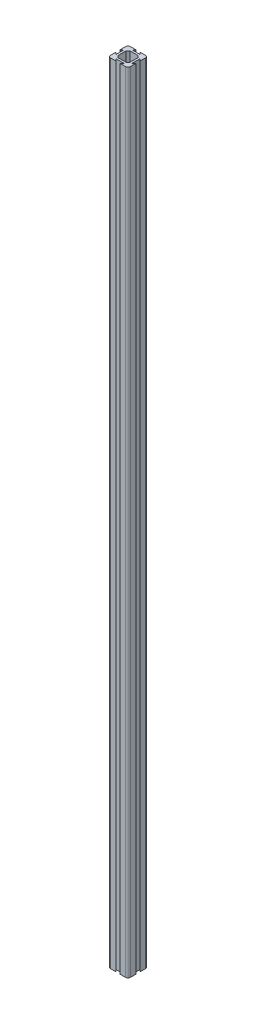
ISO-10303-21;
HEADER;
FILE_DESCRIPTION(('STEP AP214'),'2;1');
FILE_NAME('part.step','',(''),(''),'','','');
FILE_SCHEMA(('AUTOMOTIVE_DESIGN { 1 0 10303 214 1 1 1 1 }'));
ENDSEC;
DATA;
#1=APPLICATION_CONTEXT('core data for automotive mechanical design processes');
#2=APPLICATION_PROTOCOL_DEFINITION('international standard','automotive_design',2000,#1);
#3=PRODUCT_CONTEXT('',#1,'mechanical');
#4=PRODUCT('Part','Part','',(#3));
#5=PRODUCT_RELATED_PRODUCT_CATEGORY('part','',(#4));
#6=PRODUCT_DEFINITION_FORMATION('','',#4);
#7=PRODUCT_DEFINITION_CONTEXT('part definition',#1,'design');
#8=PRODUCT_DEFINITION('design','',#6,#7);
#9=PRODUCT_DEFINITION_SHAPE('','',#8);
#10=(LENGTH_UNIT() NAMED_UNIT(*) SI_UNIT(.MILLI.,.METRE.));
#11=(NAMED_UNIT(*) PLANE_ANGLE_UNIT() SI_UNIT($,.RADIAN.));
#12=(NAMED_UNIT(*) SI_UNIT($,.STERADIAN.) SOLID_ANGLE_UNIT());
#13=UNCERTAINTY_MEASURE_WITH_UNIT(LENGTH_MEASURE(1.E-05),#10,'distance_accuracy_value','');
#14=(GEOMETRIC_REPRESENTATION_CONTEXT(3) GLOBAL_UNCERTAINTY_ASSIGNED_CONTEXT((#13)) GLOBAL_UNIT_ASSIGNED_CONTEXT((#10,
#11,#12)) REPRESENTATION_CONTEXT('',''));
#15=CARTESIAN_POINT('',(0.,0.,0.));
#16=DIRECTION('',(0.,0.,1.));
#17=DIRECTION('',(1.,0.,0.));
#18=AXIS2_PLACEMENT_3D('',#15,#16,#17);
#19=CARTESIAN_POINT('',(9.5,1000.,-9.5));
#20=DIRECTION('',(0.,-1.,0.));
#21=DIRECTION('',(0.,0.,-1.));
#22=AXIS2_PLACEMENT_3D('',#19,#20,#21);
#23=PLANE('',#22);
#24=DIRECTION('',(0.707106781186551,0.,-0.707106781186544));
#25=VECTOR('',#24,1.);
#26=CARTESIAN_POINT('',(-2.5,1000.,-12.5));
#27=LINE('',#26,#25);
#28=CARTESIAN_POINT('',(-5.00000000000002,1000.,-10.));
#29=VERTEX_POINT('',#28);
#30=CARTESIAN_POINT('',(-2.5,1000.,-12.5));
#31=VERTEX_POINT('',#30);
#32=EDGE_CURVE('E308',#29,#31,#27,.T.);
#33=ORIENTED_EDGE('',*,*,#32,.T.);
#34=DIRECTION('',(-1.,0.,0.));
#35=VECTOR('',#34,1.);
#36=CARTESIAN_POINT('',(-9.49999999999998,1000.,-12.5));
#37=LINE('',#36,#35);
#38=CARTESIAN_POINT('',(-9.49999999999998,1000.,-12.5));
#39=VERTEX_POINT('',#38);
#40=EDGE_CURVE('E311',#31,#39,#37,.T.);
#41=ORIENTED_EDGE('',*,*,#40,.T.);
#42=CARTESIAN_POINT('',(-9.5,1000.,-9.5));
#43=DIRECTION('',(0.,1.,0.));
#44=DIRECTION('',(0.,0.,1.));
#45=AXIS2_PLACEMENT_3D('',#42,#43,#44);
#46=CIRCLE('',#45,3.);
#47=CARTESIAN_POINT('',(-12.5,1000.,-9.49999999999998));
#48=VERTEX_POINT('',#47);
#49=EDGE_CURVE('E314',#39,#48,#46,.T.);
#50=ORIENTED_EDGE('',*,*,#49,.T.);
#51=DIRECTION('',(0.,0.,1.));
#52=VECTOR('',#51,1.);
#53=CARTESIAN_POINT('',(-12.5,1000.,-2.5));
#54=LINE('',#53,#52);
#55=CARTESIAN_POINT('',(-12.5,1000.,-2.5));
#56=VERTEX_POINT('',#55);
#57=EDGE_CURVE('E316',#48,#56,#54,.T.);
#58=ORIENTED_EDGE('',*,*,#57,.T.);
#59=DIRECTION('',(0.707106781186552,0.,-0.707106781186543));
#60=VECTOR('',#59,1.);
#61=CARTESIAN_POINT('',(-10.,1000.,-4.99999999999997));
#62=LINE('',#61,#60);
#63=CARTESIAN_POINT('',(-10.,1000.,-4.99999999999997));
#64=VERTEX_POINT('',#63);
#65=EDGE_CURVE('E318',#56,#64,#62,.T.);
#66=ORIENTED_EDGE('',*,*,#65,.T.);
#67=DIRECTION('',(0.,0.,1.));
#68=VECTOR('',#67,1.);
#69=CARTESIAN_POINT('',(-10.,1000.,5.00000000000003));
#70=LINE('',#69,#68);
#71=CARTESIAN_POINT('',(-10.,1000.,5.00000000000003));
#72=VERTEX_POINT('',#71);
#73=EDGE_CURVE('E320',#64,#72,#70,.T.);
#74=ORIENTED_EDGE('',*,*,#73,.T.);
#75=DIRECTION('',(-0.707106781186544,0.,-0.707106781186551));
#76=VECTOR('',#75,1.);
#77=CARTESIAN_POINT('',(-12.5,1000.,2.5));
#78=LINE('',#77,#76);
#79=CARTESIAN_POINT('',(-12.5,1000.,2.5));
#80=VERTEX_POINT('',#79);
#81=EDGE_CURVE('E322',#72,#80,#78,.T.);
#82=ORIENTED_EDGE('',*,*,#81,.T.);
#83=DIRECTION('',(0.,0.,1.));
#84=VECTOR('',#83,1.);
#85=CARTESIAN_POINT('',(-12.5,1000.,9.49999999999998));
#86=LINE('',#85,#84);
#87=CARTESIAN_POINT('',(-12.5,1000.,9.49999999999998));
#88=VERTEX_POINT('',#87);
#89=EDGE_CURVE('E324',#80,#88,#86,.T.);
#90=ORIENTED_EDGE('',*,*,#89,.T.);
#91=CARTESIAN_POINT('',(-9.5,1000.,9.5));
#92=DIRECTION('',(0.,1.,0.));
#93=DIRECTION('',(0.,0.,-1.));
#94=AXIS2_PLACEMENT_3D('',#91,#92,#93);
#95=CIRCLE('',#94,3.);
#96=CARTESIAN_POINT('',(-9.49999999999998,1000.,12.5));
#97=VERTEX_POINT('',#96);
#98=EDGE_CURVE('E326',#88,#97,#95,.T.);
#99=ORIENTED_EDGE('',*,*,#98,.T.);
#100=DIRECTION('',(1.,0.,0.));
#101=VECTOR('',#100,1.);
#102=CARTESIAN_POINT('',(-2.5,1000.,12.5));
#103=LINE('',#102,#101);
#104=CARTESIAN_POINT('',(-2.5,1000.,12.5));
#105=VERTEX_POINT('',#104);
#106=EDGE_CURVE('E328',#97,#105,#103,.T.);
#107=ORIENTED_EDGE('',*,*,#106,.T.);
#108=DIRECTION('',(-0.707106781186544,0.,-0.707106781186551));
#109=VECTOR('',#108,1.);
#110=CARTESIAN_POINT('',(-2.5,1000.,12.5));
#111=LINE('',#110,#109);
#112=CARTESIAN_POINT('',(-4.99999999999998,1000.,10.));
#113=VERTEX_POINT('',#112);
#114=EDGE_CURVE('E330',#105,#113,#111,.T.);
#115=ORIENTED_EDGE('',*,*,#114,.T.);
#116=DIRECTION('',(1.,0.,0.));
#117=VECTOR('',#116,1.);
#118=CARTESIAN_POINT('',(-4.99999999999998,1000.,10.));
#119=LINE('',#118,#117);
#120=CARTESIAN_POINT('',(5.00000000000002,1000.,10.));
#121=VERTEX_POINT('',#120);
#122=EDGE_CURVE('E332',#113,#121,#119,.T.);
#123=ORIENTED_EDGE('',*,*,#122,.T.);
#124=DIRECTION('',(-0.707106781186551,0.,0.707106781186544));
#125=VECTOR('',#124,1.);
#126=CARTESIAN_POINT('',(5.00000000000002,1000.,10.));
#127=LINE('',#126,#125);
#128=CARTESIAN_POINT('',(2.5,1000.,12.5));
#129=VERTEX_POINT('',#128);
#130=EDGE_CURVE('E334',#121,#129,#127,.T.);
#131=ORIENTED_EDGE('',*,*,#130,.T.);
#132=DIRECTION('',(1.,0.,0.));
#133=VECTOR('',#132,1.);
#134=CARTESIAN_POINT('',(9.49999999999998,1000.,12.5));
#135=LINE('',#134,#133);
#136=CARTESIAN_POINT('',(9.49999999999998,1000.,12.5));
#137=VERTEX_POINT('',#136);
#138=EDGE_CURVE('E336',#129,#137,#135,.T.);
#139=ORIENTED_EDGE('',*,*,#138,.T.);
#140=CARTESIAN_POINT('',(9.5,1000.,9.5));
#141=DIRECTION('',(0.,1.,0.));
#142=DIRECTION('',(0.,0.,-1.));
#143=AXIS2_PLACEMENT_3D('',#140,#141,#142);
#144=CIRCLE('',#143,3.);
#145=CARTESIAN_POINT('',(12.5,1000.,9.49999999999998));
#146=VERTEX_POINT('',#145);
#147=EDGE_CURVE('E338',#137,#146,#144,.T.);
#148=ORIENTED_EDGE('',*,*,#147,.T.);
#149=DIRECTION('',(0.,0.,-1.));
#150=VECTOR('',#149,1.);
#151=CARTESIAN_POINT('',(12.5,1000.,2.5));
#152=LINE('',#151,#150);
#153=CARTESIAN_POINT('',(12.5,1000.,2.5));
#154=VERTEX_POINT('',#153);
#155=EDGE_CURVE('E340',#146,#154,#152,.T.);
#156=ORIENTED_EDGE('',*,*,#155,.T.);
#157=DIRECTION('',(-0.707106781186551,0.,0.707106781186544));
#158=VECTOR('',#157,1.);
#159=CARTESIAN_POINT('',(9.99999999999999,1000.,4.99999999999998));
#160=LINE('',#159,#158);
#161=CARTESIAN_POINT('',(9.99999999999999,1000.,4.99999999999998));
#162=VERTEX_POINT('',#161);
#163=EDGE_CURVE('E342',#154,#162,#160,.T.);
#164=ORIENTED_EDGE('',*,*,#163,.T.);
#165=DIRECTION('',(0.,0.,-1.));
#166=VECTOR('',#165,1.);
#167=CARTESIAN_POINT('',(10.,1000.,-5.00000000000002));
#168=LINE('',#167,#166);
#169=CARTESIAN_POINT('',(10.,1000.,-5.00000000000002));
#170=VERTEX_POINT('',#169);
#171=EDGE_CURVE('E344',#162,#170,#168,.T.);
#172=ORIENTED_EDGE('',*,*,#171,.T.);
#173=DIRECTION('',(0.707106781186545,0.,0.70710678118655));
#174=VECTOR('',#173,1.);
#175=CARTESIAN_POINT('',(12.5,1000.,-2.5));
#176=LINE('',#175,#174);
#177=CARTESIAN_POINT('',(12.5,1000.,-2.5));
#178=VERTEX_POINT('',#177);
#179=EDGE_CURVE('E346',#170,#178,#176,.T.);
#180=ORIENTED_EDGE('',*,*,#179,.T.);
#181=DIRECTION('',(0.,0.,-1.));
#182=VECTOR('',#181,1.);
#183=CARTESIAN_POINT('',(12.5,1000.,-9.49999999999998));
#184=LINE('',#183,#182);
#185=CARTESIAN_POINT('',(12.5,1000.,-9.49999999999998));
#186=VERTEX_POINT('',#185);
#187=EDGE_CURVE('E348',#178,#186,#184,.T.);
#188=ORIENTED_EDGE('',*,*,#187,.T.);
#189=CARTESIAN_POINT('',(9.5,1000.,-9.5));
#190=DIRECTION('',(0.,1.,0.));
#191=DIRECTION('',(0.,0.,-1.));
#192=AXIS2_PLACEMENT_3D('',#189,#190,#191);
#193=CIRCLE('',#192,3.);
#194=CARTESIAN_POINT('',(9.49999999999998,1000.,-12.5));
#195=VERTEX_POINT('',#194);
#196=EDGE_CURVE('E350',#186,#195,#193,.T.);
#197=ORIENTED_EDGE('',*,*,#196,.T.);
#198=DIRECTION('',(-1.,0.,0.));
#199=VECTOR('',#198,1.);
#200=CARTESIAN_POINT('',(2.5,1000.,-12.5));
#201=LINE('',#200,#199);
#202=CARTESIAN_POINT('',(2.5,1000.,-12.5));
#203=VERTEX_POINT('',#202);
#204=EDGE_CURVE('E352',#195,#203,#201,.T.);
#205=ORIENTED_EDGE('',*,*,#204,.T.);
#206=DIRECTION('',(0.707106781186544,0.,0.707106781186551));
#207=VECTOR('',#206,1.);
#208=CARTESIAN_POINT('',(4.99999999999998,1000.,-10.));
#209=LINE('',#208,#207);
#210=CARTESIAN_POINT('',(4.99999999999998,1000.,-10.));
#211=VERTEX_POINT('',#210);
#212=EDGE_CURVE('E354',#203,#211,#209,.T.);
#213=ORIENTED_EDGE('',*,*,#212,.T.);
#214=DIRECTION('',(-1.,0.,0.));
#215=VECTOR('',#214,1.);
#216=CARTESIAN_POINT('',(-5.00000000000002,1000.,-10.));
#217=LINE('',#216,#215);
#218=EDGE_CURVE('E356',#211,#29,#217,.T.);
#219=ORIENTED_EDGE('',*,*,#218,.T.);
#220=EDGE_LOOP('',(#33,#41,#50,#58,#66,#74,#82,#90,#99,#107,#115,#123,#131,#139,#148,#156,#164,
#172,#180,#188,#197,#205,#213,#219));
#221=FACE_BOUND('',#220,.T.);
#222=DIRECTION('',(0.,0.,1.));
#223=VECTOR('',#222,1.);
#224=CARTESIAN_POINT('',(-7.5,1000.,5.));
#225=LINE('',#224,#223);
#226=CARTESIAN_POINT('',(-7.5,1000.,-5.));
#227=VERTEX_POINT('',#226);
#228=CARTESIAN_POINT('',(-7.5,1000.,5.));
#229=VERTEX_POINT('',#228);
#230=EDGE_CURVE('E243',#227,#229,#225,.T.);
#231=ORIENTED_EDGE('',*,*,#230,.F.);
#232=DIRECTION('',(-0.707106781186553,0.,0.707106781186543));
#233=VECTOR('',#232,1.);
#234=CARTESIAN_POINT('',(-7.5,1000.,-5.));
#235=LINE('',#234,#233);
#236=CARTESIAN_POINT('',(-4.99999999999996,1000.,-7.5));
#237=VERTEX_POINT('',#236);
#238=EDGE_CURVE('E276',#237,#227,#235,.T.);
#239=ORIENTED_EDGE('',*,*,#238,.F.);
#240=DIRECTION('',(-1.,0.,0.));
#241=VECTOR('',#240,1.);
#242=CARTESIAN_POINT('',(-4.99999999999996,1000.,-7.5));
#243=LINE('',#242,#241);
#244=CARTESIAN_POINT('',(5.00000000000003,1000.,-7.50000000000001));
#245=VERTEX_POINT('',#244);
#246=EDGE_CURVE('E274',#245,#237,#243,.T.);
#247=ORIENTED_EDGE('',*,*,#246,.F.);
#248=DIRECTION('',(-0.707106781186543,0.,-0.707106781186552));
#249=VECTOR('',#248,1.);
#250=CARTESIAN_POINT('',(5.00000000000003,1000.,-7.50000000000001));
#251=LINE('',#250,#249);
#252=CARTESIAN_POINT('',(7.50000000000004,1000.,-4.99999999999997));
#253=VERTEX_POINT('',#252);
#254=EDGE_CURVE('E272',#253,#245,#251,.T.);
#255=ORIENTED_EDGE('',*,*,#254,.F.);
#256=DIRECTION('',(0.,0.,-1.));
#257=VECTOR('',#256,1.);
#258=CARTESIAN_POINT('',(7.50000000000004,1000.,-4.99999999999997));
#259=LINE('',#258,#257);
#260=CARTESIAN_POINT('',(7.50000000000004,1000.,5.00000000000003));
#261=VERTEX_POINT('',#260);
#262=EDGE_CURVE('E270',#261,#253,#259,.T.);
#263=ORIENTED_EDGE('',*,*,#262,.F.);
#264=DIRECTION('',(0.707106781186552,0.,-0.707106781186543));
#265=VECTOR('',#264,1.);
#266=CARTESIAN_POINT('',(7.50000000000004,1000.,5.00000000000003));
#267=LINE('',#266,#265);
#268=CARTESIAN_POINT('',(5.00000000000001,1000.,7.50000000000004));
#269=VERTEX_POINT('',#268);
#270=EDGE_CURVE('E266',#269,#261,#267,.T.);
#271=ORIENTED_EDGE('',*,*,#270,.F.);
#272=DIRECTION('',(1.,0.,0.));
#273=VECTOR('',#272,1.);
#274=CARTESIAN_POINT('',(5.00000000000001,1000.,7.50000000000004));
#275=LINE('',#274,#273);
#276=CARTESIAN_POINT('',(-4.99999999999999,1000.,7.50000000000004));
#277=VERTEX_POINT('',#276);
#278=EDGE_CURVE('E264',#277,#269,#275,.T.);
#279=ORIENTED_EDGE('',*,*,#278,.F.);
#280=DIRECTION('',(0.707106781186543,0.,0.707106781186552));
#281=VECTOR('',#280,1.);
#282=CARTESIAN_POINT('',(-4.99999999999999,1000.,7.50000000000004));
#283=LINE('',#282,#281);
#284=EDGE_CURVE('E251',#229,#277,#283,.T.);
#285=ORIENTED_EDGE('',*,*,#284,.F.);
#286=EDGE_LOOP('',(#231,#239,#247,#255,#263,#271,#279,#285));
#287=FACE_BOUND('',#286,.T.);
#288=ADVANCED_FACE('F34',(#221,#287),#23,.F.);
#289=CARTESIAN_POINT('',(9.5,0.,-9.5));
#290=DIRECTION('',(0.,-1.,0.));
#291=DIRECTION('',(0.,0.,-1.));
#292=AXIS2_PLACEMENT_3D('',#289,#290,#291);
#293=PLANE('',#292);
#294=DIRECTION('',(0.707106781186551,0.,-0.707106781186544));
#295=VECTOR('',#294,1.);
#296=CARTESIAN_POINT('',(-2.5,0.,-12.5));
#297=LINE('',#296,#295);
#298=CARTESIAN_POINT('',(-5.00000000000002,0.,-10.));
#299=VERTEX_POINT('',#298);
#300=CARTESIAN_POINT('',(-2.5,0.,-12.5));
#301=VERTEX_POINT('',#300);
#302=EDGE_CURVE('E259',#299,#301,#297,.T.);
#303=ORIENTED_EDGE('',*,*,#302,.F.);
#304=DIRECTION('',(-1.,0.,0.));
#305=VECTOR('',#304,1.);
#306=CARTESIAN_POINT('',(-5.00000000000002,0.,-10.));
#307=LINE('',#306,#305);
#308=CARTESIAN_POINT('',(4.99999999999998,0.,-10.));
#309=VERTEX_POINT('',#308);
#310=EDGE_CURVE('E312',#309,#299,#307,.T.);
#311=ORIENTED_EDGE('',*,*,#310,.F.);
#312=DIRECTION('',(0.707106781186544,0.,0.707106781186551));
#313=VECTOR('',#312,1.);
#314=CARTESIAN_POINT('',(4.99999999999998,0.,-10.));
#315=LINE('',#314,#313);
#316=CARTESIAN_POINT('',(2.5,0.,-12.5));
#317=VERTEX_POINT('',#316);
#318=EDGE_CURVE('E403',#317,#309,#315,.T.);
#319=ORIENTED_EDGE('',*,*,#318,.F.);
#320=DIRECTION('',(-1.,0.,0.));
#321=VECTOR('',#320,1.);
#322=CARTESIAN_POINT('',(2.5,0.,-12.5));
#323=LINE('',#322,#321);
#324=CARTESIAN_POINT('',(9.49999999999998,0.,-12.5));
#325=VERTEX_POINT('',#324);
#326=EDGE_CURVE('E401',#325,#317,#323,.T.);
#327=ORIENTED_EDGE('',*,*,#326,.F.);
#328=CARTESIAN_POINT('',(9.5,0.,-9.5));
#329=DIRECTION('',(0.,1.,0.));
#330=DIRECTION('',(0.,0.,-1.));
#331=AXIS2_PLACEMENT_3D('',#328,#329,#330);
#332=CIRCLE('',#331,3.);
#333=CARTESIAN_POINT('',(12.5,0.,-9.49999999999998));
#334=VERTEX_POINT('',#333);
#335=EDGE_CURVE('E399',#334,#325,#332,.T.);
#336=ORIENTED_EDGE('',*,*,#335,.F.);
#337=DIRECTION('',(0.,0.,-1.));
#338=VECTOR('',#337,1.);
#339=CARTESIAN_POINT('',(12.5,0.,-9.49999999999998));
#340=LINE('',#339,#338);
#341=CARTESIAN_POINT('',(12.5,0.,-2.5));
#342=VERTEX_POINT('',#341);
#343=EDGE_CURVE('E397',#342,#334,#340,.T.);
#344=ORIENTED_EDGE('',*,*,#343,.F.);
#345=DIRECTION('',(0.707106781186545,0.,0.70710678118655));
#346=VECTOR('',#345,1.);
#347=CARTESIAN_POINT('',(12.5,0.,-2.5));
#348=LINE('',#347,#346);
#349=CARTESIAN_POINT('',(10.,0.,-5.00000000000002));
#350=VERTEX_POINT('',#349);
#351=EDGE_CURVE('E395',#350,#342,#348,.T.);
#352=ORIENTED_EDGE('',*,*,#351,.F.);
#353=DIRECTION('',(0.,0.,-1.));
#354=VECTOR('',#353,1.);
#355=CARTESIAN_POINT('',(10.,0.,-5.00000000000002));
#356=LINE('',#355,#354);
#357=CARTESIAN_POINT('',(9.99999999999999,0.,4.99999999999998));
#358=VERTEX_POINT('',#357);
#359=EDGE_CURVE('E393',#358,#350,#356,.T.);
#360=ORIENTED_EDGE('',*,*,#359,.F.);
#361=DIRECTION('',(-0.707106781186551,0.,0.707106781186544));
#362=VECTOR('',#361,1.);
#363=CARTESIAN_POINT('',(9.99999999999999,0.,4.99999999999998));
#364=LINE('',#363,#362);
#365=CARTESIAN_POINT('',(12.5,0.,2.5));
#366=VERTEX_POINT('',#365);
#367=EDGE_CURVE('E391',#366,#358,#364,.T.);
#368=ORIENTED_EDGE('',*,*,#367,.F.);
#369=DIRECTION('',(0.,0.,-1.));
#370=VECTOR('',#369,1.);
#371=CARTESIAN_POINT('',(12.5,0.,2.5));
#372=LINE('',#371,#370);
#373=CARTESIAN_POINT('',(12.5,0.,9.49999999999998));
#374=VERTEX_POINT('',#373);
#375=EDGE_CURVE('E389',#374,#366,#372,.T.);
#376=ORIENTED_EDGE('',*,*,#375,.F.);
#377=CARTESIAN_POINT('',(9.5,0.,9.5));
#378=DIRECTION('',(0.,1.,0.));
#379=DIRECTION('',(0.,0.,-1.));
#380=AXIS2_PLACEMENT_3D('',#377,#378,#379);
#381=CIRCLE('',#380,3.);
#382=CARTESIAN_POINT('',(9.49999999999998,0.,12.5));
#383=VERTEX_POINT('',#382);
#384=EDGE_CURVE('E387',#383,#374,#381,.T.);
#385=ORIENTED_EDGE('',*,*,#384,.F.);
#386=DIRECTION('',(1.,0.,0.));
#387=VECTOR('',#386,1.);
#388=CARTESIAN_POINT('',(9.49999999999998,0.,12.5));
#389=LINE('',#388,#387);
#390=CARTESIAN_POINT('',(2.5,0.,12.5));
#391=VERTEX_POINT('',#390);
#392=EDGE_CURVE('E385',#391,#383,#389,.T.);
#393=ORIENTED_EDGE('',*,*,#392,.F.);
#394=DIRECTION('',(-0.707106781186551,0.,0.707106781186544));
#395=VECTOR('',#394,1.);
#396=CARTESIAN_POINT('',(5.00000000000002,0.,10.));
#397=LINE('',#396,#395);
#398=CARTESIAN_POINT('',(5.00000000000002,0.,10.));
#399=VERTEX_POINT('',#398);
#400=EDGE_CURVE('E383',#399,#391,#397,.T.);
#401=ORIENTED_EDGE('',*,*,#400,.F.);
#402=DIRECTION('',(1.,0.,0.));
#403=VECTOR('',#402,1.);
#404=CARTESIAN_POINT('',(-4.99999999999998,0.,10.));
#405=LINE('',#404,#403);
#406=CARTESIAN_POINT('',(-4.99999999999998,0.,10.));
#407=VERTEX_POINT('',#406);
#408=EDGE_CURVE('E381',#407,#399,#405,.T.);
#409=ORIENTED_EDGE('',*,*,#408,.F.);
#410=DIRECTION('',(-0.707106781186544,0.,-0.707106781186551));
#411=VECTOR('',#410,1.);
#412=CARTESIAN_POINT('',(-2.5,0.,12.5));
#413=LINE('',#412,#411);
#414=CARTESIAN_POINT('',(-2.5,0.,12.5));
#415=VERTEX_POINT('',#414);
#416=EDGE_CURVE('E379',#415,#407,#413,.T.);
#417=ORIENTED_EDGE('',*,*,#416,.F.);
#418=DIRECTION('',(1.,0.,0.));
#419=VECTOR('',#418,1.);
#420=CARTESIAN_POINT('',(-2.5,0.,12.5));
#421=LINE('',#420,#419);
#422=CARTESIAN_POINT('',(-9.49999999999998,0.,12.5));
#423=VERTEX_POINT('',#422);
#424=EDGE_CURVE('E377',#423,#415,#421,.T.);
#425=ORIENTED_EDGE('',*,*,#424,.F.);
#426=CARTESIAN_POINT('',(-9.5,0.,9.5));
#427=DIRECTION('',(0.,1.,0.));
#428=DIRECTION('',(0.,0.,-1.));
#429=AXIS2_PLACEMENT_3D('',#426,#427,#428);
#430=CIRCLE('',#429,3.);
#431=CARTESIAN_POINT('',(-12.5,0.,9.49999999999998));
#432=VERTEX_POINT('',#431);
#433=EDGE_CURVE('E375',#432,#423,#430,.T.);
#434=ORIENTED_EDGE('',*,*,#433,.F.);
#435=DIRECTION('',(0.,0.,1.));
#436=VECTOR('',#435,1.);
#437=CARTESIAN_POINT('',(-12.5,0.,9.49999999999998));
#438=LINE('',#437,#436);
#439=CARTESIAN_POINT('',(-12.5,0.,2.5));
#440=VERTEX_POINT('',#439);
#441=EDGE_CURVE('E373',#440,#432,#438,.T.);
#442=ORIENTED_EDGE('',*,*,#441,.F.);
#443=DIRECTION('',(-0.707106781186544,0.,-0.707106781186551));
#444=VECTOR('',#443,1.);
#445=CARTESIAN_POINT('',(-12.5,0.,2.5));
#446=LINE('',#445,#444);
#447=CARTESIAN_POINT('',(-10.,0.,5.00000000000003));
#448=VERTEX_POINT('',#447);
#449=EDGE_CURVE('E371',#448,#440,#446,.T.);
#450=ORIENTED_EDGE('',*,*,#449,.F.);
#451=DIRECTION('',(0.,0.,1.));
#452=VECTOR('',#451,1.);
#453=CARTESIAN_POINT('',(-10.,0.,5.00000000000003));
#454=LINE('',#453,#452);
#455=CARTESIAN_POINT('',(-10.,0.,-4.99999999999997));
#456=VERTEX_POINT('',#455);
#457=EDGE_CURVE('E369',#456,#448,#454,.T.);
#458=ORIENTED_EDGE('',*,*,#457,.F.);
#459=DIRECTION('',(0.707106781186552,0.,-0.707106781186543));
#460=VECTOR('',#459,1.);
#461=CARTESIAN_POINT('',(-10.,0.,-4.99999999999997));
#462=LINE('',#461,#460);
#463=CARTESIAN_POINT('',(-12.5,0.,-2.5));
#464=VERTEX_POINT('',#463);
#465=EDGE_CURVE('E367',#464,#456,#462,.T.);
#466=ORIENTED_EDGE('',*,*,#465,.F.);
#467=DIRECTION('',(0.,0.,1.));
#468=VECTOR('',#467,1.);
#469=CARTESIAN_POINT('',(-12.5,0.,-2.5));
#470=LINE('',#469,#468);
#471=CARTESIAN_POINT('',(-12.5,0.,-9.49999999999998));
#472=VERTEX_POINT('',#471);
#473=EDGE_CURVE('E365',#472,#464,#470,.T.);
#474=ORIENTED_EDGE('',*,*,#473,.F.);
#475=CARTESIAN_POINT('',(-9.5,0.,-9.5));
#476=DIRECTION('',(0.,1.,0.));
#477=DIRECTION('',(0.,0.,1.));
#478=AXIS2_PLACEMENT_3D('',#475,#476,#477);
#479=CIRCLE('',#478,3.);
#480=CARTESIAN_POINT('',(-9.49999999999998,0.,-12.5));
#481=VERTEX_POINT('',#480);
#482=EDGE_CURVE('E363',#481,#472,#479,.T.);
#483=ORIENTED_EDGE('',*,*,#482,.F.);
#484=DIRECTION('',(-1.,0.,0.));
#485=VECTOR('',#484,1.);
#486=CARTESIAN_POINT('',(-9.49999999999998,0.,-12.5));
#487=LINE('',#486,#485);
#488=EDGE_CURVE('E361',#301,#481,#487,.T.);
#489=ORIENTED_EDGE('',*,*,#488,.F.);
#490=EDGE_LOOP('',(#303,#311,#319,#327,#336,#344,#352,#360,#368,#376,#385,#393,#401,#409,#417,
#425,#434,#442,#450,#458,#466,#474,#483,#489));
#491=FACE_BOUND('',#490,.T.);
#492=DIRECTION('',(-0.707106781186553,0.,0.707106781186543));
#493=VECTOR('',#492,1.);
#494=CARTESIAN_POINT('',(-7.5,0.,-5.));
#495=LINE('',#494,#493);
#496=CARTESIAN_POINT('',(-4.99999999999996,0.,-7.5));
#497=VERTEX_POINT('',#496);
#498=CARTESIAN_POINT('',(-7.5,0.,-5.));
#499=VERTEX_POINT('',#498);
#500=EDGE_CURVE('E252',#497,#499,#495,.T.);
#501=ORIENTED_EDGE('',*,*,#500,.T.);
#502=DIRECTION('',(0.,0.,1.));
#503=VECTOR('',#502,1.);
#504=CARTESIAN_POINT('',(-7.5,0.,5.));
#505=LINE('',#504,#503);
#506=CARTESIAN_POINT('',(-7.5,0.,5.));
#507=VERTEX_POINT('',#506);
#508=EDGE_CURVE('E57',#499,#507,#505,.T.);
#509=ORIENTED_EDGE('',*,*,#508,.T.);
#510=DIRECTION('',(0.707106781186543,0.,0.707106781186552));
#511=VECTOR('',#510,1.);
#512=CARTESIAN_POINT('',(-4.99999999999999,0.,7.50000000000004));
#513=LINE('',#512,#511);
#514=CARTESIAN_POINT('',(-4.99999999999999,0.,7.50000000000004));
#515=VERTEX_POINT('',#514);
#516=EDGE_CURVE('E258',#507,#515,#513,.T.);
#517=ORIENTED_EDGE('',*,*,#516,.T.);
#518=DIRECTION('',(1.,0.,0.));
#519=VECTOR('',#518,1.);
#520=CARTESIAN_POINT('',(5.00000000000001,0.,7.50000000000004));
#521=LINE('',#520,#519);
#522=CARTESIAN_POINT('',(5.00000000000001,0.,7.50000000000004));
#523=VERTEX_POINT('',#522);
#524=EDGE_CURVE('E280',#515,#523,#521,.T.);
#525=ORIENTED_EDGE('',*,*,#524,.T.);
#526=DIRECTION('',(0.707106781186552,0.,-0.707106781186543));
#527=VECTOR('',#526,1.);
#528=CARTESIAN_POINT('',(7.50000000000004,0.,5.00000000000003));
#529=LINE('',#528,#527);
#530=CARTESIAN_POINT('',(7.50000000000004,0.,5.00000000000003));
#531=VERTEX_POINT('',#530);
#532=EDGE_CURVE('E283',#523,#531,#529,.T.);
#533=ORIENTED_EDGE('',*,*,#532,.T.);
#534=DIRECTION('',(0.,0.,-1.));
#535=VECTOR('',#534,1.);
#536=CARTESIAN_POINT('',(7.50000000000004,0.,-4.99999999999997));
#537=LINE('',#536,#535);
#538=CARTESIAN_POINT('',(7.50000000000004,0.,-4.99999999999997));
#539=VERTEX_POINT('',#538);
#540=EDGE_CURVE('E286',#531,#539,#537,.T.);
#541=ORIENTED_EDGE('',*,*,#540,.T.);
#542=DIRECTION('',(-0.707106781186543,0.,-0.707106781186552));
#543=VECTOR('',#542,1.);
#544=CARTESIAN_POINT('',(5.00000000000003,0.,-7.50000000000001));
#545=LINE('',#544,#543);
#546=CARTESIAN_POINT('',(5.00000000000003,0.,-7.50000000000001));
#547=VERTEX_POINT('',#546);
#548=EDGE_CURVE('E289',#539,#547,#545,.T.);
#549=ORIENTED_EDGE('',*,*,#548,.T.);
#550=DIRECTION('',(-1.,0.,0.));
#551=VECTOR('',#550,1.);
#552=CARTESIAN_POINT('',(-4.99999999999996,0.,-7.5));
#553=LINE('',#552,#551);
#554=EDGE_CURVE('E292',#547,#497,#553,.T.);
#555=ORIENTED_EDGE('',*,*,#554,.T.);
#556=EDGE_LOOP('',(#501,#509,#517,#525,#533,#541,#549,#555));
#557=FACE_BOUND('',#556,.T.);
#558=ADVANCED_FACE('F481',(#491,#557),#293,.T.);
#559=CARTESIAN_POINT('',(-2.5,1000.,-12.5));
#560=DIRECTION('',(-0.707106781186544,0.,-0.707106781186551));
#561=DIRECTION('',(-0.707106781186551,0.,0.707106781186544));
#562=AXIS2_PLACEMENT_3D('',#559,#560,#561);
#563=PLANE('',#562);
#564=ORIENTED_EDGE('',*,*,#302,.T.);
#565=DIRECTION('',(0.,-1.,0.));
#566=VECTOR('',#565,1.);
#567=CARTESIAN_POINT('',(-2.5,1000.,-12.5));
#568=LINE('',#567,#566);
#569=EDGE_CURVE('E11',#31,#301,#568,.T.);
#570=ORIENTED_EDGE('',*,*,#569,.F.);
#571=ORIENTED_EDGE('',*,*,#32,.F.);
#572=DIRECTION('',(0.,-1.,0.));
#573=VECTOR('',#572,1.);
#574=CARTESIAN_POINT('',(-5.00000000000002,1000.,-10.));
#575=LINE('',#574,#573);
#576=EDGE_CURVE('E358',#29,#299,#575,.T.);
#577=ORIENTED_EDGE('',*,*,#576,.T.);
#578=EDGE_LOOP('',(#564,#570,#571,#577));
#579=FACE_BOUND('',#578,.T.);
#580=ADVANCED_FACE('F36',(#579),#563,.F.);
#581=CARTESIAN_POINT('',(-9.49999999999998,1000.,-12.5));
#582=DIRECTION('',(0.,0.,1.));
#583=DIRECTION('',(1.,0.,0.));
#584=AXIS2_PLACEMENT_3D('',#581,#582,#583);
#585=PLANE('',#584);
#586=ORIENTED_EDGE('',*,*,#488,.T.);
#587=DIRECTION('',(0.,-1.,0.));
#588=VECTOR('',#587,1.);
#589=CARTESIAN_POINT('',(-9.49999999999998,1000.,-12.5));
#590=LINE('',#589,#588);
#591=EDGE_CURVE('E42',#39,#481,#590,.T.);
#592=ORIENTED_EDGE('',*,*,#591,.F.);
#593=ORIENTED_EDGE('',*,*,#40,.F.);
#594=ORIENTED_EDGE('',*,*,#569,.T.);
#595=EDGE_LOOP('',(#586,#592,#593,#594));
#596=FACE_BOUND('',#595,.T.);
#597=ADVANCED_FACE('F498',(#596),#585,.F.);
#598=CARTESIAN_POINT('',(-9.5,1000.,-9.5));
#599=DIRECTION('',(0.,-1.,0.));
#600=DIRECTION('',(0.,0.,-1.));
#601=AXIS2_PLACEMENT_3D('',#598,#599,#600);
#602=CYLINDRICAL_SURFACE('',#601,3.);
#603=ORIENTED_EDGE('',*,*,#482,.T.);
#604=DIRECTION('',(0.,-1.,0.));
#605=VECTOR('',#604,1.);
#606=CARTESIAN_POINT('',(-12.5,1000.,-9.49999999999998));
#607=LINE('',#606,#605);
#608=EDGE_CURVE('E468',#48,#472,#607,.T.);
#609=ORIENTED_EDGE('',*,*,#608,.F.);
#610=ORIENTED_EDGE('',*,*,#49,.F.);
#611=ORIENTED_EDGE('',*,*,#591,.T.);
#612=EDGE_LOOP('',(#603,#609,#610,#611));
#613=FACE_BOUND('',#612,.T.);
#614=ADVANCED_FACE('F475',(#613),#602,.T.);
#615=CARTESIAN_POINT('',(-12.5,1000.,-2.5));
#616=DIRECTION('',(1.,0.,0.));
#617=DIRECTION('',(0.,0.,-1.));
#618=AXIS2_PLACEMENT_3D('',#615,#616,#617);
#619=PLANE('',#618);
#620=ORIENTED_EDGE('',*,*,#473,.T.);
#621=DIRECTION('',(0.,-1.,0.));
#622=VECTOR('',#621,1.);
#623=CARTESIAN_POINT('',(-12.5,1000.,-2.5));
#624=LINE('',#623,#622);
#625=EDGE_CURVE('E465',#56,#464,#624,.T.);
#626=ORIENTED_EDGE('',*,*,#625,.F.);
#627=ORIENTED_EDGE('',*,*,#57,.F.);
#628=ORIENTED_EDGE('',*,*,#608,.T.);
#629=EDGE_LOOP('',(#620,#626,#627,#628));
#630=FACE_BOUND('',#629,.T.);
#631=ADVANCED_FACE('F487',(#630),#619,.F.);
#632=CARTESIAN_POINT('',(-10.,1000.,-4.99999999999997));
#633=DIRECTION('',(-0.707106781186543,0.,-0.707106781186552));
#634=DIRECTION('',(-0.707106781186552,0.,0.707106781186543));
#635=AXIS2_PLACEMENT_3D('',#632,#633,#634);
#636=PLANE('',#635);
#637=ORIENTED_EDGE('',*,*,#465,.T.);
#638=DIRECTION('',(0.,-1.,0.));
#639=VECTOR('',#638,1.);
#640=CARTESIAN_POINT('',(-10.,1000.,-4.99999999999997));
#641=LINE('',#640,#639);
#642=EDGE_CURVE('E462',#64,#456,#641,.T.);
#643=ORIENTED_EDGE('',*,*,#642,.F.);
#644=ORIENTED_EDGE('',*,*,#65,.F.);
#645=ORIENTED_EDGE('',*,*,#625,.T.);
#646=EDGE_LOOP('',(#637,#643,#644,#645));
#647=FACE_BOUND('',#646,.T.);
#648=ADVANCED_FACE('F491',(#647),#636,.F.);
#649=CARTESIAN_POINT('',(-10.,1000.,5.00000000000003));
#650=DIRECTION('',(1.,0.,0.));
#651=DIRECTION('',(0.,0.,-1.));
#652=AXIS2_PLACEMENT_3D('',#649,#650,#651);
#653=PLANE('',#652);
#654=ORIENTED_EDGE('',*,*,#457,.T.);
#655=DIRECTION('',(0.,-1.,0.));
#656=VECTOR('',#655,1.);
#657=CARTESIAN_POINT('',(-10.,1000.,5.00000000000003));
#658=LINE('',#657,#656);
#659=EDGE_CURVE('E459',#72,#448,#658,.T.);
#660=ORIENTED_EDGE('',*,*,#659,.F.);
#661=ORIENTED_EDGE('',*,*,#73,.F.);
#662=ORIENTED_EDGE('',*,*,#642,.T.);
#663=EDGE_LOOP('',(#654,#660,#661,#662));
#664=FACE_BOUND('',#663,.T.);
#665=ADVANCED_FACE('F591',(#664),#653,.F.);
#666=CARTESIAN_POINT('',(-12.5,1000.,2.5));
#667=DIRECTION('',(-0.707106781186551,0.,0.707106781186544));
#668=DIRECTION('',(0.707106781186544,0.,0.707106781186551));
#669=AXIS2_PLACEMENT_3D('',#666,#667,#668);
#670=PLANE('',#669);
#671=ORIENTED_EDGE('',*,*,#449,.T.);
#672=DIRECTION('',(0.,-1.,0.));
#673=VECTOR('',#672,1.);
#674=CARTESIAN_POINT('',(-12.5,1000.,2.5));
#675=LINE('',#674,#673);
#676=EDGE_CURVE('E456',#80,#440,#675,.T.);
#677=ORIENTED_EDGE('',*,*,#676,.F.);
#678=ORIENTED_EDGE('',*,*,#81,.F.);
#679=ORIENTED_EDGE('',*,*,#659,.T.);
#680=EDGE_LOOP('',(#671,#677,#678,#679));
#681=FACE_BOUND('',#680,.T.);
#682=ADVANCED_FACE('F589',(#681),#670,.F.);
#683=CARTESIAN_POINT('',(-12.5,1000.,9.49999999999998));
#684=DIRECTION('',(1.,0.,0.));
#685=DIRECTION('',(0.,0.,-1.));
#686=AXIS2_PLACEMENT_3D('',#683,#684,#685);
#687=PLANE('',#686);
#688=ORIENTED_EDGE('',*,*,#441,.T.);
#689=DIRECTION('',(0.,-1.,0.));
#690=VECTOR('',#689,1.);
#691=CARTESIAN_POINT('',(-12.5,1000.,9.49999999999998));
#692=LINE('',#691,#690);
#693=EDGE_CURVE('E453',#88,#432,#692,.T.);
#694=ORIENTED_EDGE('',*,*,#693,.F.);
#695=ORIENTED_EDGE('',*,*,#89,.F.);
#696=ORIENTED_EDGE('',*,*,#676,.T.);
#697=EDGE_LOOP('',(#688,#694,#695,#696));
#698=FACE_BOUND('',#697,.T.);
#699=ADVANCED_FACE('F585',(#698),#687,.F.);
#700=CARTESIAN_POINT('',(-9.5,1000.,9.5));
#701=DIRECTION('',(0.,-1.,0.));
#702=DIRECTION('',(0.,0.,-1.));
#703=AXIS2_PLACEMENT_3D('',#700,#701,#702);
#704=CYLINDRICAL_SURFACE('',#703,3.);
#705=ORIENTED_EDGE('',*,*,#433,.T.);
#706=DIRECTION('',(0.,-1.,0.));
#707=VECTOR('',#706,1.);
#708=CARTESIAN_POINT('',(-9.49999999999998,1000.,12.5));
#709=LINE('',#708,#707);
#710=EDGE_CURVE('E450',#97,#423,#709,.T.);
#711=ORIENTED_EDGE('',*,*,#710,.F.);
#712=ORIENTED_EDGE('',*,*,#98,.F.);
#713=ORIENTED_EDGE('',*,*,#693,.T.);
#714=EDGE_LOOP('',(#705,#711,#712,#713));
#715=FACE_BOUND('',#714,.T.);
#716=ADVANCED_FACE('F580',(#715),#704,.T.);
#717=CARTESIAN_POINT('',(-2.5,1000.,12.5));
#718=DIRECTION('',(0.,0.,-1.));
#719=DIRECTION('',(-1.,0.,0.));
#720=AXIS2_PLACEMENT_3D('',#717,#718,#719);
#721=PLANE('',#720);
#722=ORIENTED_EDGE('',*,*,#424,.T.);
#723=DIRECTION('',(0.,-1.,0.));
#724=VECTOR('',#723,1.);
#725=CARTESIAN_POINT('',(-2.5,1000.,12.5));
#726=LINE('',#725,#724);
#727=EDGE_CURVE('E447',#105,#415,#726,.T.);
#728=ORIENTED_EDGE('',*,*,#727,.F.);
#729=ORIENTED_EDGE('',*,*,#106,.F.);
#730=ORIENTED_EDGE('',*,*,#710,.T.);
#731=EDGE_LOOP('',(#722,#728,#729,#730));
#732=FACE_BOUND('',#731,.T.);
#733=ADVANCED_FACE('F574',(#732),#721,.F.);
#734=CARTESIAN_POINT('',(-2.5,1000.,12.5));
#735=DIRECTION('',(-0.707106781186551,0.,0.707106781186544));
#736=DIRECTION('',(0.707106781186544,0.,0.707106781186551));
#737=AXIS2_PLACEMENT_3D('',#734,#735,#736);
#738=PLANE('',#737);
#739=ORIENTED_EDGE('',*,*,#416,.T.);
#740=DIRECTION('',(0.,-1.,0.));
#741=VECTOR('',#740,1.);
#742=CARTESIAN_POINT('',(-4.99999999999998,1000.,10.));
#743=LINE('',#742,#741);
#744=EDGE_CURVE('E444',#113,#407,#743,.T.);
#745=ORIENTED_EDGE('',*,*,#744,.F.);
#746=ORIENTED_EDGE('',*,*,#114,.F.);
#747=ORIENTED_EDGE('',*,*,#727,.T.);
#748=EDGE_LOOP('',(#739,#745,#746,#747));
#749=FACE_BOUND('',#748,.T.);
#750=ADVANCED_FACE('F570',(#749),#738,.F.);
#751=CARTESIAN_POINT('',(-4.99999999999998,1000.,10.));
#752=DIRECTION('',(0.,0.,-1.));
#753=DIRECTION('',(-1.,0.,0.));
#754=AXIS2_PLACEMENT_3D('',#751,#752,#753);
#755=PLANE('',#754);
#756=ORIENTED_EDGE('',*,*,#408,.T.);
#757=DIRECTION('',(0.,-1.,0.));
#758=VECTOR('',#757,1.);
#759=CARTESIAN_POINT('',(5.00000000000002,1000.,10.));
#760=LINE('',#759,#758);
#761=EDGE_CURVE('E441',#121,#399,#760,.T.);
#762=ORIENTED_EDGE('',*,*,#761,.F.);
#763=ORIENTED_EDGE('',*,*,#122,.F.);
#764=ORIENTED_EDGE('',*,*,#744,.T.);
#765=EDGE_LOOP('',(#756,#762,#763,#764));
#766=FACE_BOUND('',#765,.T.);
#767=ADVANCED_FACE('F565',(#766),#755,.F.);
#768=CARTESIAN_POINT('',(5.00000000000002,1000.,10.));
#769=DIRECTION('',(0.707106781186544,0.,0.707106781186551));
#770=DIRECTION('',(0.707106781186551,0.,-0.707106781186544));
#771=AXIS2_PLACEMENT_3D('',#768,#769,#770);
#772=PLANE('',#771);
#773=ORIENTED_EDGE('',*,*,#400,.T.);
#774=DIRECTION('',(0.,-1.,0.));
#775=VECTOR('',#774,1.);
#776=CARTESIAN_POINT('',(2.5,1000.,12.5));
#777=LINE('',#776,#775);
#778=EDGE_CURVE('E438',#129,#391,#777,.T.);
#779=ORIENTED_EDGE('',*,*,#778,.F.);
#780=ORIENTED_EDGE('',*,*,#130,.F.);
#781=ORIENTED_EDGE('',*,*,#761,.T.);
#782=EDGE_LOOP('',(#773,#779,#780,#781));
#783=FACE_BOUND('',#782,.T.);
#784=ADVANCED_FACE('F559',(#783),#772,.F.);
#785=CARTESIAN_POINT('',(9.49999999999998,1000.,12.5));
#786=DIRECTION('',(0.,0.,-1.));
#787=DIRECTION('',(-1.,0.,0.));
#788=AXIS2_PLACEMENT_3D('',#785,#786,#787);
#789=PLANE('',#788);
#790=ORIENTED_EDGE('',*,*,#392,.T.);
#791=DIRECTION('',(0.,-1.,0.));
#792=VECTOR('',#791,1.);
#793=CARTESIAN_POINT('',(9.49999999999998,1000.,12.5));
#794=LINE('',#793,#792);
#795=EDGE_CURVE('E435',#137,#383,#794,.T.);
#796=ORIENTED_EDGE('',*,*,#795,.F.);
#797=ORIENTED_EDGE('',*,*,#138,.F.);
#798=ORIENTED_EDGE('',*,*,#778,.T.);
#799=EDGE_LOOP('',(#790,#796,#797,#798));
#800=FACE_BOUND('',#799,.T.);
#801=ADVANCED_FACE('F555',(#800),#789,.F.);
#802=CARTESIAN_POINT('',(9.5,1000.,9.5));
#803=DIRECTION('',(0.,-1.,0.));
#804=DIRECTION('',(0.,0.,-1.));
#805=AXIS2_PLACEMENT_3D('',#802,#803,#804);
#806=CYLINDRICAL_SURFACE('',#805,3.);
#807=ORIENTED_EDGE('',*,*,#384,.T.);
#808=DIRECTION('',(0.,-1.,0.));
#809=VECTOR('',#808,1.);
#810=CARTESIAN_POINT('',(12.5,1000.,9.49999999999998));
#811=LINE('',#810,#809);
#812=EDGE_CURVE('E432',#146,#374,#811,.T.);
#813=ORIENTED_EDGE('',*,*,#812,.F.);
#814=ORIENTED_EDGE('',*,*,#147,.F.);
#815=ORIENTED_EDGE('',*,*,#795,.T.);
#816=EDGE_LOOP('',(#807,#813,#814,#815));
#817=FACE_BOUND('',#816,.T.);
#818=ADVANCED_FACE('F550',(#817),#806,.T.);
#819=CARTESIAN_POINT('',(12.5,1000.,2.5));
#820=DIRECTION('',(-1.,0.,0.));
#821=DIRECTION('',(0.,0.,1.));
#822=AXIS2_PLACEMENT_3D('',#819,#820,#821);
#823=PLANE('',#822);
#824=ORIENTED_EDGE('',*,*,#375,.T.);
#825=DIRECTION('',(0.,-1.,0.));
#826=VECTOR('',#825,1.);
#827=CARTESIAN_POINT('',(12.5,1000.,2.5));
#828=LINE('',#827,#826);
#829=EDGE_CURVE('E429',#154,#366,#828,.T.);
#830=ORIENTED_EDGE('',*,*,#829,.F.);
#831=ORIENTED_EDGE('',*,*,#155,.F.);
#832=ORIENTED_EDGE('',*,*,#812,.T.);
#833=EDGE_LOOP('',(#824,#830,#831,#832));
#834=FACE_BOUND('',#833,.T.);
#835=ADVANCED_FACE('F544',(#834),#823,.F.);
#836=CARTESIAN_POINT('',(9.99999999999999,1000.,4.99999999999998));
#837=DIRECTION('',(0.707106781186544,0.,0.707106781186551));
#838=DIRECTION('',(0.707106781186551,0.,-0.707106781186544));
#839=AXIS2_PLACEMENT_3D('',#836,#837,#838);
#840=PLANE('',#839);
#841=ORIENTED_EDGE('',*,*,#367,.T.);
#842=DIRECTION('',(0.,-1.,0.));
#843=VECTOR('',#842,1.);
#844=CARTESIAN_POINT('',(9.99999999999999,1000.,4.99999999999998));
#845=LINE('',#844,#843);
#846=EDGE_CURVE('E426',#162,#358,#845,.T.);
#847=ORIENTED_EDGE('',*,*,#846,.F.);
#848=ORIENTED_EDGE('',*,*,#163,.F.);
#849=ORIENTED_EDGE('',*,*,#829,.T.);
#850=EDGE_LOOP('',(#841,#847,#848,#849));
#851=FACE_BOUND('',#850,.T.);
#852=ADVANCED_FACE('F540',(#851),#840,.F.);
#853=CARTESIAN_POINT('',(10.,1000.,-5.00000000000002));
#854=DIRECTION('',(-1.,0.,0.));
#855=DIRECTION('',(0.,0.,1.));
#856=AXIS2_PLACEMENT_3D('',#853,#854,#855);
#857=PLANE('',#856);
#858=ORIENTED_EDGE('',*,*,#359,.T.);
#859=DIRECTION('',(0.,-1.,0.));
#860=VECTOR('',#859,1.);
#861=CARTESIAN_POINT('',(10.,1000.,-5.00000000000002));
#862=LINE('',#861,#860);
#863=EDGE_CURVE('E423',#170,#350,#862,.T.);
#864=ORIENTED_EDGE('',*,*,#863,.F.);
#865=ORIENTED_EDGE('',*,*,#171,.F.);
#866=ORIENTED_EDGE('',*,*,#846,.T.);
#867=EDGE_LOOP('',(#858,#864,#865,#866));
#868=FACE_BOUND('',#867,.T.);
#869=ADVANCED_FACE('F535',(#868),#857,.F.);
#870=CARTESIAN_POINT('',(12.5,1000.,-2.5));
#871=DIRECTION('',(0.70710678118655,0.,-0.707106781186545));
#872=DIRECTION('',(-0.707106781186545,0.,-0.70710678118655));
#873=AXIS2_PLACEMENT_3D('',#870,#871,#872);
#874=PLANE('',#873);
#875=ORIENTED_EDGE('',*,*,#351,.T.);
#876=DIRECTION('',(0.,-1.,0.));
#877=VECTOR('',#876,1.);
#878=CARTESIAN_POINT('',(12.5,1000.,-2.5));
#879=LINE('',#878,#877);
#880=EDGE_CURVE('E420',#178,#342,#879,.T.);
#881=ORIENTED_EDGE('',*,*,#880,.F.);
#882=ORIENTED_EDGE('',*,*,#179,.F.);
#883=ORIENTED_EDGE('',*,*,#863,.T.);
#884=EDGE_LOOP('',(#875,#881,#882,#883));
#885=FACE_BOUND('',#884,.T.);
#886=ADVANCED_FACE('F529',(#885),#874,.F.);
#887=CARTESIAN_POINT('',(12.5,1000.,-9.49999999999998));
#888=DIRECTION('',(-1.,0.,0.));
#889=DIRECTION('',(0.,0.,1.));
#890=AXIS2_PLACEMENT_3D('',#887,#888,#889);
#891=PLANE('',#890);
#892=ORIENTED_EDGE('',*,*,#343,.T.);
#893=DIRECTION('',(0.,-1.,0.));
#894=VECTOR('',#893,1.);
#895=CARTESIAN_POINT('',(12.5,1000.,-9.49999999999998));
#896=LINE('',#895,#894);
#897=EDGE_CURVE('E417',#186,#334,#896,.T.);
#898=ORIENTED_EDGE('',*,*,#897,.F.);
#899=ORIENTED_EDGE('',*,*,#187,.F.);
#900=ORIENTED_EDGE('',*,*,#880,.T.);
#901=EDGE_LOOP('',(#892,#898,#899,#900));
#902=FACE_BOUND('',#901,.T.);
#903=ADVANCED_FACE('F525',(#902),#891,.F.);
#904=CARTESIAN_POINT('',(9.5,1000.,-9.5));
#905=DIRECTION('',(0.,-1.,0.));
#906=DIRECTION('',(0.,0.,-1.));
#907=AXIS2_PLACEMENT_3D('',#904,#905,#906);
#908=CYLINDRICAL_SURFACE('',#907,3.);
#909=ORIENTED_EDGE('',*,*,#335,.T.);
#910=DIRECTION('',(0.,-1.,0.));
#911=VECTOR('',#910,1.);
#912=CARTESIAN_POINT('',(9.49999999999998,1000.,-12.5));
#913=LINE('',#912,#911);
#914=EDGE_CURVE('E414',#195,#325,#913,.T.);
#915=ORIENTED_EDGE('',*,*,#914,.F.);
#916=ORIENTED_EDGE('',*,*,#196,.F.);
#917=ORIENTED_EDGE('',*,*,#897,.T.);
#918=EDGE_LOOP('',(#909,#915,#916,#917));
#919=FACE_BOUND('',#918,.T.);
#920=ADVANCED_FACE('F520',(#919),#908,.T.);
#921=CARTESIAN_POINT('',(2.5,1000.,-12.5));
#922=DIRECTION('',(0.,0.,1.));
#923=DIRECTION('',(1.,0.,0.));
#924=AXIS2_PLACEMENT_3D('',#921,#922,#923);
#925=PLANE('',#924);
#926=ORIENTED_EDGE('',*,*,#326,.T.);
#927=DIRECTION('',(0.,-1.,0.));
#928=VECTOR('',#927,1.);
#929=CARTESIAN_POINT('',(2.5,1000.,-12.5));
#930=LINE('',#929,#928);
#931=EDGE_CURVE('E411',#203,#317,#930,.T.);
#932=ORIENTED_EDGE('',*,*,#931,.F.);
#933=ORIENTED_EDGE('',*,*,#204,.F.);
#934=ORIENTED_EDGE('',*,*,#914,.T.);
#935=EDGE_LOOP('',(#926,#932,#933,#934));
#936=FACE_BOUND('',#935,.T.);
#937=ADVANCED_FACE('F514',(#936),#925,.F.);
#938=CARTESIAN_POINT('',(4.99999999999998,1000.,-10.));
#939=DIRECTION('',(0.707106781186551,0.,-0.707106781186544));
#940=DIRECTION('',(-0.707106781186544,0.,-0.707106781186551));
#941=AXIS2_PLACEMENT_3D('',#938,#939,#940);
#942=PLANE('',#941);
#943=ORIENTED_EDGE('',*,*,#318,.T.);
#944=DIRECTION('',(0.,-1.,0.));
#945=VECTOR('',#944,1.);
#946=CARTESIAN_POINT('',(4.99999999999998,1000.,-10.));
#947=LINE('',#946,#945);
#948=EDGE_CURVE('E408',#211,#309,#947,.T.);
#949=ORIENTED_EDGE('',*,*,#948,.F.);
#950=ORIENTED_EDGE('',*,*,#212,.F.);
#951=ORIENTED_EDGE('',*,*,#931,.T.);
#952=EDGE_LOOP('',(#943,#949,#950,#951));
#953=FACE_BOUND('',#952,.T.);
#954=ADVANCED_FACE('F510',(#953),#942,.F.);
#955=CARTESIAN_POINT('',(-5.00000000000002,1000.,-10.));
#956=DIRECTION('',(0.,0.,1.));
#957=DIRECTION('',(1.,0.,0.));
#958=AXIS2_PLACEMENT_3D('',#955,#956,#957);
#959=PLANE('',#958);
#960=ORIENTED_EDGE('',*,*,#310,.T.);
#961=ORIENTED_EDGE('',*,*,#576,.F.);
#962=ORIENTED_EDGE('',*,*,#218,.F.);
#963=ORIENTED_EDGE('',*,*,#948,.T.);
#964=EDGE_LOOP('',(#960,#961,#962,#963));
#965=FACE_BOUND('',#964,.T.);
#966=ADVANCED_FACE('F505',(#965),#959,.F.);
#967=CARTESIAN_POINT('',(-7.5,1000.,5.));
#968=DIRECTION('',(1.,0.,0.));
#969=DIRECTION('',(0.,0.,-1.));
#970=AXIS2_PLACEMENT_3D('',#967,#968,#969);
#971=PLANE('',#970);
#972=ORIENTED_EDGE('',*,*,#508,.F.);
#973=DIRECTION('',(0.,-1.,0.));
#974=VECTOR('',#973,1.);
#975=CARTESIAN_POINT('',(-7.5,1000.,-5.));
#976=LINE('',#975,#974);
#977=EDGE_CURVE('E247',#227,#499,#976,.T.);
#978=ORIENTED_EDGE('',*,*,#977,.F.);
#979=ORIENTED_EDGE('',*,*,#230,.T.);
#980=DIRECTION('',(0.,-1.,0.));
#981=VECTOR('',#980,1.);
#982=CARTESIAN_POINT('',(-7.5,1000.,5.));
#983=LINE('',#982,#981);
#984=EDGE_CURVE('E246',#229,#507,#983,.T.);
#985=ORIENTED_EDGE('',*,*,#984,.T.);
#986=EDGE_LOOP('',(#972,#978,#979,#985));
#987=FACE_BOUND('',#986,.T.);
#988=ADVANCED_FACE('F245',(#987),#971,.T.);
#989=CARTESIAN_POINT('',(-4.99999999999999,1000.,7.50000000000004));
#990=DIRECTION('',(0.707106781186552,0.,-0.707106781186543));
#991=DIRECTION('',(-0.707106781186543,0.,-0.707106781186552));
#992=AXIS2_PLACEMENT_3D('',#989,#990,#991);
#993=PLANE('',#992);
#994=ORIENTED_EDGE('',*,*,#516,.F.);
#995=ORIENTED_EDGE('',*,*,#984,.F.);
#996=ORIENTED_EDGE('',*,*,#284,.T.);
#997=DIRECTION('',(0.,-1.,0.));
#998=VECTOR('',#997,1.);
#999=CARTESIAN_POINT('',(-4.99999999999999,1000.,7.50000000000004));
#1000=LINE('',#999,#998);
#1001=EDGE_CURVE('E260',#277,#515,#1000,.T.);
#1002=ORIENTED_EDGE('',*,*,#1001,.T.);
#1003=EDGE_LOOP('',(#994,#995,#996,#1002));
#1004=FACE_BOUND('',#1003,.T.);
#1005=ADVANCED_FACE('F255',(#1004),#993,.T.);
#1006=CARTESIAN_POINT('',(5.00000000000001,1000.,7.50000000000004));
#1007=DIRECTION('',(0.,0.,-1.));
#1008=DIRECTION('',(-1.,0.,0.));
#1009=AXIS2_PLACEMENT_3D('',#1006,#1007,#1008);
#1010=PLANE('',#1009);
#1011=ORIENTED_EDGE('',*,*,#524,.F.);
#1012=ORIENTED_EDGE('',*,*,#1001,.F.);
#1013=ORIENTED_EDGE('',*,*,#278,.T.);
#1014=DIRECTION('',(0.,-1.,0.));
#1015=VECTOR('',#1014,1.);
#1016=CARTESIAN_POINT('',(5.00000000000001,1000.,7.50000000000004));
#1017=LINE('',#1016,#1015);
#1018=EDGE_CURVE('E305',#269,#523,#1017,.T.);
#1019=ORIENTED_EDGE('',*,*,#1018,.T.);
#1020=EDGE_LOOP('',(#1011,#1012,#1013,#1019));
#1021=FACE_BOUND('',#1020,.T.);
#1022=ADVANCED_FACE('F723',(#1021),#1010,.T.);
#1023=CARTESIAN_POINT('',(7.50000000000004,1000.,5.00000000000003));
#1024=DIRECTION('',(-0.707106781186543,0.,-0.707106781186552));
#1025=DIRECTION('',(-0.707106781186552,0.,0.707106781186543));
#1026=AXIS2_PLACEMENT_3D('',#1023,#1024,#1025);
#1027=PLANE('',#1026);
#1028=ORIENTED_EDGE('',*,*,#532,.F.);
#1029=ORIENTED_EDGE('',*,*,#1018,.F.);
#1030=ORIENTED_EDGE('',*,*,#270,.T.);
#1031=DIRECTION('',(0.,-1.,0.));
#1032=VECTOR('',#1031,1.);
#1033=CARTESIAN_POINT('',(7.50000000000004,1000.,5.00000000000003));
#1034=LINE('',#1033,#1032);
#1035=EDGE_CURVE('E303',#261,#531,#1034,.T.);
#1036=ORIENTED_EDGE('',*,*,#1035,.T.);
#1037=EDGE_LOOP('',(#1028,#1029,#1030,#1036));
#1038=FACE_BOUND('',#1037,.T.);
#1039=ADVANCED_FACE('F729',(#1038),#1027,.T.);
#1040=CARTESIAN_POINT('',(7.50000000000004,1000.,-4.99999999999997));
#1041=DIRECTION('',(-1.,0.,0.));
#1042=DIRECTION('',(0.,0.,1.));
#1043=AXIS2_PLACEMENT_3D('',#1040,#1041,#1042);
#1044=PLANE('',#1043);
#1045=ORIENTED_EDGE('',*,*,#540,.F.);
#1046=ORIENTED_EDGE('',*,*,#1035,.F.);
#1047=ORIENTED_EDGE('',*,*,#262,.T.);
#1048=DIRECTION('',(0.,-1.,0.));
#1049=VECTOR('',#1048,1.);
#1050=CARTESIAN_POINT('',(7.50000000000004,1000.,-4.99999999999997));
#1051=LINE('',#1050,#1049);
#1052=EDGE_CURVE('E301',#253,#539,#1051,.T.);
#1053=ORIENTED_EDGE('',*,*,#1052,.T.);
#1054=EDGE_LOOP('',(#1045,#1046,#1047,#1053));
#1055=FACE_BOUND('',#1054,.T.);
#1056=ADVANCED_FACE('F737',(#1055),#1044,.T.);
#1057=CARTESIAN_POINT('',(5.00000000000003,1000.,-7.50000000000001));
#1058=DIRECTION('',(-0.707106781186552,0.,0.707106781186543));
#1059=DIRECTION('',(0.707106781186543,0.,0.707106781186552));
#1060=AXIS2_PLACEMENT_3D('',#1057,#1058,#1059);
#1061=PLANE('',#1060);
#1062=ORIENTED_EDGE('',*,*,#548,.F.);
#1063=ORIENTED_EDGE('',*,*,#1052,.F.);
#1064=ORIENTED_EDGE('',*,*,#254,.T.);
#1065=DIRECTION('',(0.,-1.,0.));
#1066=VECTOR('',#1065,1.);
#1067=CARTESIAN_POINT('',(5.00000000000003,1000.,-7.50000000000001));
#1068=LINE('',#1067,#1066);
#1069=EDGE_CURVE('E299',#245,#547,#1068,.T.);
#1070=ORIENTED_EDGE('',*,*,#1069,.T.);
#1071=EDGE_LOOP('',(#1062,#1063,#1064,#1070));
#1072=FACE_BOUND('',#1071,.T.);
#1073=ADVANCED_FACE('F745',(#1072),#1061,.T.);
#1074=CARTESIAN_POINT('',(-4.99999999999996,1000.,-7.5));
#1075=DIRECTION('',(0.,0.,1.));
#1076=DIRECTION('',(1.,0.,0.));
#1077=AXIS2_PLACEMENT_3D('',#1074,#1075,#1076);
#1078=PLANE('',#1077);
#1079=ORIENTED_EDGE('',*,*,#554,.F.);
#1080=ORIENTED_EDGE('',*,*,#1069,.F.);
#1081=ORIENTED_EDGE('',*,*,#246,.T.);
#1082=DIRECTION('',(0.,-1.,0.));
#1083=VECTOR('',#1082,1.);
#1084=CARTESIAN_POINT('',(-4.99999999999996,1000.,-7.5));
#1085=LINE('',#1084,#1083);
#1086=EDGE_CURVE('E49',#237,#497,#1085,.T.);
#1087=ORIENTED_EDGE('',*,*,#1086,.T.);
#1088=EDGE_LOOP('',(#1079,#1080,#1081,#1087));
#1089=FACE_BOUND('',#1088,.T.);
#1090=ADVANCED_FACE('F753',(#1089),#1078,.T.);
#1091=CARTESIAN_POINT('',(-7.5,1000.,-5.));
#1092=DIRECTION('',(0.707106781186543,0.,0.707106781186553));
#1093=DIRECTION('',(0.707106781186553,0.,-0.707106781186543));
#1094=AXIS2_PLACEMENT_3D('',#1091,#1092,#1093);
#1095=PLANE('',#1094);
#1096=ORIENTED_EDGE('',*,*,#500,.F.);
#1097=ORIENTED_EDGE('',*,*,#1086,.F.);
#1098=ORIENTED_EDGE('',*,*,#238,.T.);
#1099=ORIENTED_EDGE('',*,*,#977,.T.);
#1100=EDGE_LOOP('',(#1096,#1097,#1098,#1099));
#1101=FACE_BOUND('',#1100,.T.);
#1102=ADVANCED_FACE('F761',(#1101),#1095,.T.);
#1103=CLOSED_SHELL('',(#288,#558,#580,#597,#614,#631,#648,#665,#682,#699,#716,#733,#750,#767,
#784,#801,#818,#835,#852,#869,#886,#903,#920,#937,#954,#966,#988,#1005,#1022,#1039,#1056,#1073,
#1090,#1102));
#1104=MANIFOLD_SOLID_BREP('B2',#1103);
#1105=ADVANCED_BREP_SHAPE_REPRESENTATION('',(#18,#1104),#14);
#1106=SHAPE_DEFINITION_REPRESENTATION(#9,#1105);
ENDSEC;
END-ISO-10303-21;
